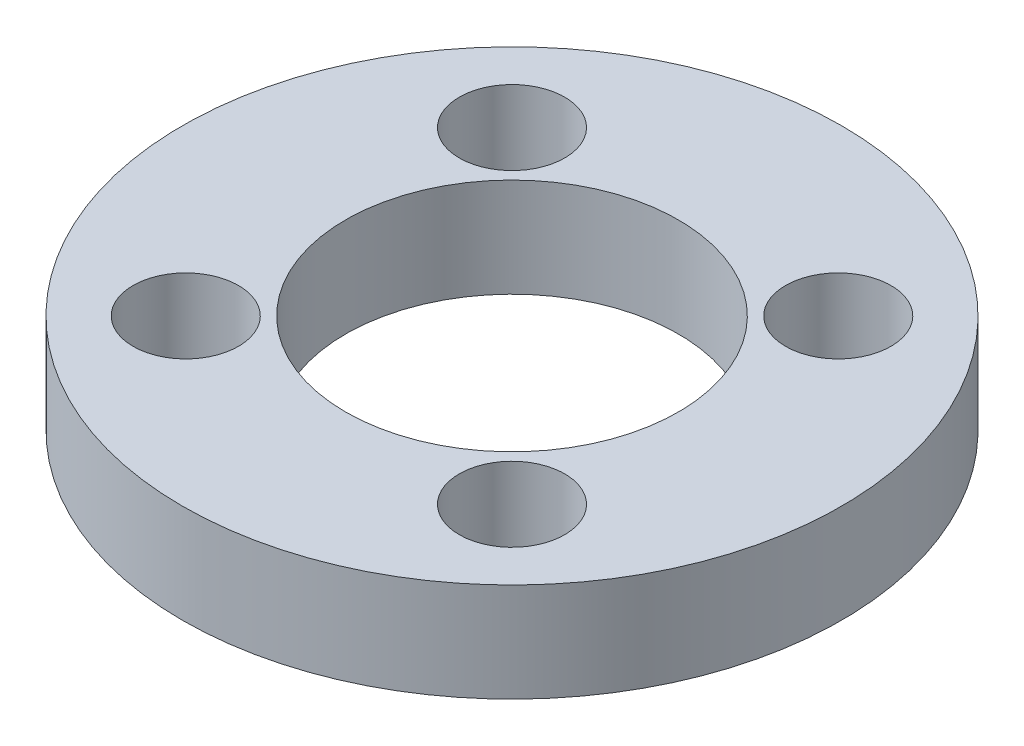
ISO-10303-21;
HEADER;
FILE_DESCRIPTION(('STEP AP214'),'2;1');
FILE_NAME('part.step','',(''),(''),'','','');
FILE_SCHEMA(('AUTOMOTIVE_DESIGN { 1 0 10303 214 1 1 1 1 }'));
ENDSEC;
DATA;
#1=APPLICATION_CONTEXT('core data for automotive mechanical design processes');
#2=APPLICATION_PROTOCOL_DEFINITION('international standard','automotive_design',2000,#1);
#3=PRODUCT_CONTEXT('',#1,'mechanical');
#4=PRODUCT('Part','Part','',(#3));
#5=PRODUCT_RELATED_PRODUCT_CATEGORY('part','',(#4));
#6=PRODUCT_DEFINITION_FORMATION('','',#4);
#7=PRODUCT_DEFINITION_CONTEXT('part definition',#1,'design');
#8=PRODUCT_DEFINITION('design','',#6,#7);
#9=PRODUCT_DEFINITION_SHAPE('','',#8);
#10=(LENGTH_UNIT() NAMED_UNIT(*) SI_UNIT(.MILLI.,.METRE.));
#11=(NAMED_UNIT(*) PLANE_ANGLE_UNIT() SI_UNIT($,.RADIAN.));
#12=(NAMED_UNIT(*) SI_UNIT($,.STERADIAN.) SOLID_ANGLE_UNIT());
#13=UNCERTAINTY_MEASURE_WITH_UNIT(LENGTH_MEASURE(1.E-05),#10,'distance_accuracy_value','');
#14=(GEOMETRIC_REPRESENTATION_CONTEXT(3) GLOBAL_UNCERTAINTY_ASSIGNED_CONTEXT((#13)) GLOBAL_UNIT_ASSIGNED_CONTEXT((#10,
#11,#12)) REPRESENTATION_CONTEXT('',''));
#15=CARTESIAN_POINT('',(0.,0.,0.));
#16=DIRECTION('',(0.,0.,1.));
#17=DIRECTION('',(1.,0.,0.));
#18=AXIS2_PLACEMENT_3D('',#15,#16,#17);
#19=CARTESIAN_POINT('',(0.,3.,0.));
#20=DIRECTION('',(0.,1.,0.));
#21=DIRECTION('',(0.,0.,1.));
#22=AXIS2_PLACEMENT_3D('',#19,#20,#21);
#23=PLANE('',#22);
#24=CARTESIAN_POINT('',(-4.94974746830583,3.,4.94974746830583));
#25=DIRECTION('',(0.,1.,0.));
#26=DIRECTION('',(0.,0.,1.));
#27=AXIS2_PLACEMENT_3D('',#24,#25,#26);
#28=CIRCLE('',#27,1.6);
#29=CARTESIAN_POINT('',(-4.94974746830583,3.,6.54974746830583));
#30=VERTEX_POINT('',#29);
#31=EDGE_CURVE('E61',#30,#30,#28,.T.);
#32=ORIENTED_EDGE('',*,*,#31,.F.);
#33=EDGE_LOOP('',(#32));
#34=FACE_BOUND('',#33,.T.);
#35=CARTESIAN_POINT('',(4.94974746830583,3.,-4.94974746830583));
#36=DIRECTION('',(0.,1.,0.));
#37=DIRECTION('',(0.,0.,1.));
#38=AXIS2_PLACEMENT_3D('',#35,#36,#37);
#39=CIRCLE('',#38,1.6);
#40=CARTESIAN_POINT('',(4.94974746830583,3.,-3.34974746830583));
#41=VERTEX_POINT('',#40);
#42=EDGE_CURVE('E49',#41,#41,#39,.T.);
#43=ORIENTED_EDGE('',*,*,#42,.F.);
#44=EDGE_LOOP('',(#43));
#45=FACE_BOUND('',#44,.T.);
#46=CARTESIAN_POINT('',(0.,3.,0.));
#47=DIRECTION('',(0.,1.,0.));
#48=DIRECTION('',(0.,0.,1.));
#49=AXIS2_PLACEMENT_3D('',#46,#47,#48);
#50=CIRCLE('',#49,10.);
#51=CARTESIAN_POINT('',(0.,3.,10.));
#52=VERTEX_POINT('',#51);
#53=EDGE_CURVE('E10',#52,#52,#50,.T.);
#54=ORIENTED_EDGE('',*,*,#53,.T.);
#55=EDGE_LOOP('',(#54));
#56=FACE_BOUND('',#55,.T.);
#57=CARTESIAN_POINT('',(0.,3.,0.));
#58=DIRECTION('',(0.,1.,0.));
#59=DIRECTION('',(0.,0.,1.));
#60=AXIS2_PLACEMENT_3D('',#57,#58,#59);
#61=CIRCLE('',#60,5.05);
#62=CARTESIAN_POINT('',(0.,3.,5.05));
#63=VERTEX_POINT('',#62);
#64=EDGE_CURVE('E44',#63,#63,#61,.T.);
#65=ORIENTED_EDGE('',*,*,#64,.F.);
#66=EDGE_LOOP('',(#65));
#67=FACE_BOUND('',#66,.T.);
#68=CARTESIAN_POINT('',(-4.94974746830583,3.,-4.94974746830583));
#69=DIRECTION('',(0.,1.,0.));
#70=DIRECTION('',(0.,0.,1.));
#71=AXIS2_PLACEMENT_3D('',#68,#69,#70);
#72=CIRCLE('',#71,1.6);
#73=CARTESIAN_POINT('',(-4.94974746830583,3.,-3.34974746830583));
#74=VERTEX_POINT('',#73);
#75=EDGE_CURVE('E55',#74,#74,#72,.T.);
#76=ORIENTED_EDGE('',*,*,#75,.F.);
#77=EDGE_LOOP('',(#76));
#78=FACE_BOUND('',#77,.T.);
#79=CARTESIAN_POINT('',(4.94974746830583,3.,4.94974746830583));
#80=DIRECTION('',(0.,1.,0.));
#81=DIRECTION('',(0.,0.,1.));
#82=AXIS2_PLACEMENT_3D('',#79,#80,#81);
#83=CIRCLE('',#82,1.6);
#84=CARTESIAN_POINT('',(4.94974746830583,3.,6.54974746830584));
#85=VERTEX_POINT('',#84);
#86=EDGE_CURVE('E67',#85,#85,#83,.T.);
#87=ORIENTED_EDGE('',*,*,#86,.F.);
#88=EDGE_LOOP('',(#87));
#89=FACE_BOUND('',#88,.T.);
#90=ADVANCED_FACE('F33',(#34,#45,#56,#67,#78,#89),#23,.T.);
#91=CARTESIAN_POINT('',(0.,0.,0.));
#92=DIRECTION('',(0.,1.,0.));
#93=DIRECTION('',(0.,0.,1.));
#94=AXIS2_PLACEMENT_3D('',#91,#92,#93);
#95=PLANE('',#94);
#96=CARTESIAN_POINT('',(0.,0.,0.));
#97=DIRECTION('',(0.,1.,0.));
#98=DIRECTION('',(0.,0.,1.));
#99=AXIS2_PLACEMENT_3D('',#96,#97,#98);
#100=CIRCLE('',#99,10.);
#101=CARTESIAN_POINT('',(0.,0.,10.));
#102=VERTEX_POINT('',#101);
#103=EDGE_CURVE('E37',#102,#102,#100,.T.);
#104=ORIENTED_EDGE('',*,*,#103,.F.);
#105=EDGE_LOOP('',(#104));
#106=FACE_BOUND('',#105,.T.);
#107=CARTESIAN_POINT('',(0.,0.,0.));
#108=DIRECTION('',(0.,1.,0.));
#109=DIRECTION('',(0.,0.,1.));
#110=AXIS2_PLACEMENT_3D('',#107,#108,#109);
#111=CIRCLE('',#110,5.05);
#112=CARTESIAN_POINT('',(0.,0.,5.05));
#113=VERTEX_POINT('',#112);
#114=EDGE_CURVE('E46',#113,#113,#111,.T.);
#115=ORIENTED_EDGE('',*,*,#114,.T.);
#116=EDGE_LOOP('',(#115));
#117=FACE_BOUND('',#116,.T.);
#118=CARTESIAN_POINT('',(4.94974746830583,0.,-4.94974746830583));
#119=DIRECTION('',(0.,1.,0.));
#120=DIRECTION('',(0.,0.,1.));
#121=AXIS2_PLACEMENT_3D('',#118,#119,#120);
#122=CIRCLE('',#121,1.6);
#123=CARTESIAN_POINT('',(4.94974746830583,0.,-3.34974746830583));
#124=VERTEX_POINT('',#123);
#125=EDGE_CURVE('E52',#124,#124,#122,.T.);
#126=ORIENTED_EDGE('',*,*,#125,.T.);
#127=EDGE_LOOP('',(#126));
#128=FACE_BOUND('',#127,.T.);
#129=CARTESIAN_POINT('',(-4.94974746830583,0.,-4.94974746830583));
#130=DIRECTION('',(0.,1.,0.));
#131=DIRECTION('',(0.,0.,1.));
#132=AXIS2_PLACEMENT_3D('',#129,#130,#131);
#133=CIRCLE('',#132,1.6);
#134=CARTESIAN_POINT('',(-4.94974746830583,0.,-3.34974746830583));
#135=VERTEX_POINT('',#134);
#136=EDGE_CURVE('E58',#135,#135,#133,.T.);
#137=ORIENTED_EDGE('',*,*,#136,.T.);
#138=EDGE_LOOP('',(#137));
#139=FACE_BOUND('',#138,.T.);
#140=CARTESIAN_POINT('',(-4.94974746830583,0.,4.94974746830583));
#141=DIRECTION('',(0.,1.,0.));
#142=DIRECTION('',(0.,0.,1.));
#143=AXIS2_PLACEMENT_3D('',#140,#141,#142);
#144=CIRCLE('',#143,1.6);
#145=CARTESIAN_POINT('',(-4.94974746830583,0.,6.54974746830583));
#146=VERTEX_POINT('',#145);
#147=EDGE_CURVE('E64',#146,#146,#144,.T.);
#148=ORIENTED_EDGE('',*,*,#147,.T.);
#149=EDGE_LOOP('',(#148));
#150=FACE_BOUND('',#149,.T.);
#151=CARTESIAN_POINT('',(4.94974746830583,0.,4.94974746830583));
#152=DIRECTION('',(0.,1.,0.));
#153=DIRECTION('',(0.,0.,1.));
#154=AXIS2_PLACEMENT_3D('',#151,#152,#153);
#155=CIRCLE('',#154,1.6);
#156=CARTESIAN_POINT('',(4.94974746830583,0.,6.54974746830584));
#157=VERTEX_POINT('',#156);
#158=EDGE_CURVE('E70',#157,#157,#155,.T.);
#159=ORIENTED_EDGE('',*,*,#158,.T.);
#160=EDGE_LOOP('',(#159));
#161=FACE_BOUND('',#160,.T.);
#162=ADVANCED_FACE('F80',(#106,#117,#128,#139,#150,#161),#95,.F.);
#163=CARTESIAN_POINT('',(0.,3.,0.));
#164=DIRECTION('',(0.,-1.,0.));
#165=DIRECTION('',(0.,0.,-1.));
#166=AXIS2_PLACEMENT_3D('',#163,#164,#165);
#167=CYLINDRICAL_SURFACE('',#166,10.);
#168=ORIENTED_EDGE('',*,*,#53,.F.);
#169=EDGE_LOOP('',(#168));
#170=FACE_BOUND('',#169,.T.);
#171=ORIENTED_EDGE('',*,*,#103,.T.);
#172=EDGE_LOOP('',(#171));
#173=FACE_BOUND('',#172,.T.);
#174=ADVANCED_FACE('F35',(#170,#173),#167,.T.);
#175=CARTESIAN_POINT('',(0.,3.,0.));
#176=DIRECTION('',(0.,-1.,0.));
#177=DIRECTION('',(0.,0.,-1.));
#178=AXIS2_PLACEMENT_3D('',#175,#176,#177);
#179=CYLINDRICAL_SURFACE('',#178,5.05);
#180=ORIENTED_EDGE('',*,*,#64,.T.);
#181=EDGE_LOOP('',(#180));
#182=FACE_BOUND('',#181,.T.);
#183=ORIENTED_EDGE('',*,*,#114,.F.);
#184=EDGE_LOOP('',(#183));
#185=FACE_BOUND('',#184,.T.);
#186=ADVANCED_FACE('F90',(#182,#185),#179,.F.);
#187=CARTESIAN_POINT('',(4.94974746830583,3.,-4.94974746830583));
#188=DIRECTION('',(0.,-1.,0.));
#189=DIRECTION('',(0.,0.,-1.));
#190=AXIS2_PLACEMENT_3D('',#187,#188,#189);
#191=CYLINDRICAL_SURFACE('',#190,1.6);
#192=ORIENTED_EDGE('',*,*,#42,.T.);
#193=EDGE_LOOP('',(#192));
#194=FACE_BOUND('',#193,.T.);
#195=ORIENTED_EDGE('',*,*,#125,.F.);
#196=EDGE_LOOP('',(#195));
#197=FACE_BOUND('',#196,.T.);
#198=ADVANCED_FACE('F93',(#194,#197),#191,.F.);
#199=CARTESIAN_POINT('',(-4.94974746830583,3.,-4.94974746830583));
#200=DIRECTION('',(0.,-1.,0.));
#201=DIRECTION('',(0.,0.,-1.));
#202=AXIS2_PLACEMENT_3D('',#199,#200,#201);
#203=CYLINDRICAL_SURFACE('',#202,1.6);
#204=ORIENTED_EDGE('',*,*,#75,.T.);
#205=EDGE_LOOP('',(#204));
#206=FACE_BOUND('',#205,.T.);
#207=ORIENTED_EDGE('',*,*,#136,.F.);
#208=EDGE_LOOP('',(#207));
#209=FACE_BOUND('',#208,.T.);
#210=ADVANCED_FACE('F97',(#206,#209),#203,.F.);
#211=CARTESIAN_POINT('',(-4.94974746830583,3.,4.94974746830583));
#212=DIRECTION('',(0.,-1.,0.));
#213=DIRECTION('',(0.,0.,-1.));
#214=AXIS2_PLACEMENT_3D('',#211,#212,#213);
#215=CYLINDRICAL_SURFACE('',#214,1.6);
#216=ORIENTED_EDGE('',*,*,#31,.T.);
#217=EDGE_LOOP('',(#216));
#218=FACE_BOUND('',#217,.T.);
#219=ORIENTED_EDGE('',*,*,#147,.F.);
#220=EDGE_LOOP('',(#219));
#221=FACE_BOUND('',#220,.T.);
#222=ADVANCED_FACE('F101',(#218,#221),#215,.F.);
#223=CARTESIAN_POINT('',(4.94974746830583,3.,4.94974746830583));
#224=DIRECTION('',(0.,-1.,0.));
#225=DIRECTION('',(0.,0.,-1.));
#226=AXIS2_PLACEMENT_3D('',#223,#224,#225);
#227=CYLINDRICAL_SURFACE('',#226,1.6);
#228=ORIENTED_EDGE('',*,*,#86,.T.);
#229=EDGE_LOOP('',(#228));
#230=FACE_BOUND('',#229,.T.);
#231=ORIENTED_EDGE('',*,*,#158,.F.);
#232=EDGE_LOOP('',(#231));
#233=FACE_BOUND('',#232,.T.);
#234=ADVANCED_FACE('F76',(#230,#233),#227,.F.);
#235=CLOSED_SHELL('',(#90,#162,#174,#186,#198,#210,#222,#234));
#236=MANIFOLD_SOLID_BREP('B2',#235);
#237=ADVANCED_BREP_SHAPE_REPRESENTATION('',(#18,#236),#14);
#238=SHAPE_DEFINITION_REPRESENTATION(#9,#237);
ENDSEC;
END-ISO-10303-21;
